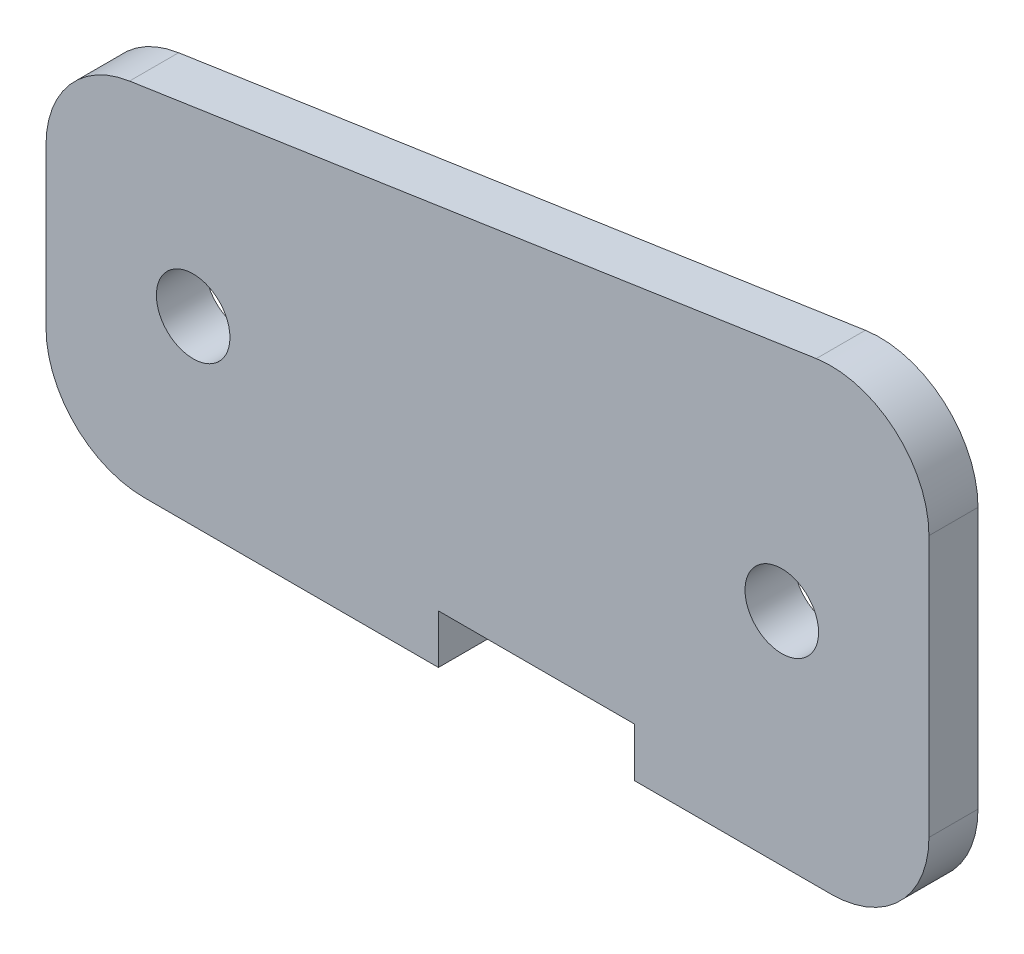
ISO-10303-21;
HEADER;
FILE_DESCRIPTION(('STEP AP214'),'2;1');
FILE_NAME('part.step','',(''),(''),'','','');
FILE_SCHEMA(('AUTOMOTIVE_DESIGN { 1 0 10303 214 1 1 1 1 }'));
ENDSEC;
DATA;
#1=APPLICATION_CONTEXT('core data for automotive mechanical design processes');
#2=APPLICATION_PROTOCOL_DEFINITION('international standard','automotive_design',2000,#1);
#3=PRODUCT_CONTEXT('',#1,'mechanical');
#4=PRODUCT('Part','Part','',(#3));
#5=PRODUCT_RELATED_PRODUCT_CATEGORY('part','',(#4));
#6=PRODUCT_DEFINITION_FORMATION('','',#4);
#7=PRODUCT_DEFINITION_CONTEXT('part definition',#1,'design');
#8=PRODUCT_DEFINITION('design','',#6,#7);
#9=PRODUCT_DEFINITION_SHAPE('','',#8);
#10=(LENGTH_UNIT() NAMED_UNIT(*) SI_UNIT(.MILLI.,.METRE.));
#11=(NAMED_UNIT(*) PLANE_ANGLE_UNIT() SI_UNIT($,.RADIAN.));
#12=(NAMED_UNIT(*) SI_UNIT($,.STERADIAN.) SOLID_ANGLE_UNIT());
#13=UNCERTAINTY_MEASURE_WITH_UNIT(LENGTH_MEASURE(1.E-05),#10,'distance_accuracy_value','');
#14=(GEOMETRIC_REPRESENTATION_CONTEXT(3) GLOBAL_UNCERTAINTY_ASSIGNED_CONTEXT((#13)) GLOBAL_UNIT_ASSIGNED_CONTEXT((#10,
#11,#12)) REPRESENTATION_CONTEXT('',''));
#15=CARTESIAN_POINT('',(0.,0.,0.));
#16=DIRECTION('',(0.,0.,1.));
#17=DIRECTION('',(1.,0.,0.));
#18=AXIS2_PLACEMENT_3D('',#15,#16,#17);
#19=CARTESIAN_POINT('',(-225.200505145563,23.9331419592028,3.175));
#20=DIRECTION('',(0.,0.,-1.));
#21=DIRECTION('',(-1.,0.,0.));
#22=AXIS2_PLACEMENT_3D('',#19,#20,#21);
#23=CYLINDRICAL_SURFACE('',#22,6.35);
#24=CARTESIAN_POINT('',(-225.200505145563,23.9331419592028,0.));
#25=DIRECTION('',(0.,0.,1.));
#26=DIRECTION('',(1.,0.,0.));
#27=AXIS2_PLACEMENT_3D('',#24,#25,#26);
#28=CIRCLE('',#27,6.35);
#29=CARTESIAN_POINT('',(-218.850505145563,23.9331419592027,0.));
#30=VERTEX_POINT('',#29);
#31=CARTESIAN_POINT('',(-226.14246702167,30.2128877999165,0.));
#32=VERTEX_POINT('',#31);
#33=EDGE_CURVE('E160',#30,#32,#28,.T.);
#34=ORIENTED_EDGE('',*,*,#33,.T.);
#35=DIRECTION('',(0.,0.,-1.));
#36=VECTOR('',#35,1.);
#37=CARTESIAN_POINT('',(-226.14246702167,30.2128877999165,3.175));
#38=LINE('',#37,#36);
#39=CARTESIAN_POINT('',(-226.14246702167,30.2128877999165,3.175));
#40=VERTEX_POINT('',#39);
#41=EDGE_CURVE('E11',#40,#32,#38,.T.);
#42=ORIENTED_EDGE('',*,*,#41,.F.);
#43=CARTESIAN_POINT('',(-225.200505145563,23.9331419592028,3.175));
#44=DIRECTION('',(0.,0.,1.));
#45=DIRECTION('',(1.,0.,0.));
#46=AXIS2_PLACEMENT_3D('',#43,#44,#45);
#47=CIRCLE('',#46,6.35);
#48=CARTESIAN_POINT('',(-218.850505145563,23.9331419592027,3.175));
#49=VERTEX_POINT('',#48);
#50=EDGE_CURVE('E100',#49,#40,#47,.T.);
#51=ORIENTED_EDGE('',*,*,#50,.F.);
#52=DIRECTION('',(0.,0.,-1.));
#53=VECTOR('',#52,1.);
#54=CARTESIAN_POINT('',(-218.850505145563,23.9331419592027,3.175));
#55=LINE('',#54,#53);
#56=EDGE_CURVE('E51',#49,#30,#55,.T.);
#57=ORIENTED_EDGE('',*,*,#56,.T.);
#58=EDGE_LOOP('',(#34,#42,#51,#57));
#59=FACE_BOUND('',#58,.T.);
#60=ADVANCED_FACE('F35',(#59),#23,.T.);
#61=CARTESIAN_POINT('',(-9.40844858481667,62.7229905654444,3.175));
#62=DIRECTION('',(-0.148340452930245,0.988936352868297,0.));
#63=DIRECTION('',(-0.988936352868298,-0.148340452930245,0.));
#64=AXIS2_PLACEMENT_3D('',#61,#62,#63);
#65=PLANE('',#64);
#66=DIRECTION('',(0.988936352868298,0.148340452930245,0.));
#67=VECTOR('',#66,1.);
#68=CARTESIAN_POINT('',(-9.40844858481667,62.7229905654444,0.));
#69=LINE('',#68,#67);
#70=CARTESIAN_POINT('',(-270.59246702167,23.5453877999165,0.));
#71=VERTEX_POINT('',#70);
#72=EDGE_CURVE('E162',#71,#32,#69,.T.);
#73=ORIENTED_EDGE('',*,*,#72,.F.);
#74=DIRECTION('',(0.,0.,-1.));
#75=VECTOR('',#74,1.);
#76=CARTESIAN_POINT('',(-270.59246702167,23.5453877999165,3.175));
#77=LINE('',#76,#75);
#78=CARTESIAN_POINT('',(-270.59246702167,23.5453877999165,3.175));
#79=VERTEX_POINT('',#78);
#80=EDGE_CURVE('E43',#79,#71,#77,.T.);
#81=ORIENTED_EDGE('',*,*,#80,.F.);
#82=DIRECTION('',(0.988936352868298,0.148340452930245,0.));
#83=VECTOR('',#82,1.);
#84=CARTESIAN_POINT('',(-9.40844858481667,62.7229905654444,3.175));
#85=LINE('',#84,#83);
#86=EDGE_CURVE('E271',#79,#40,#85,.T.);
#87=ORIENTED_EDGE('',*,*,#86,.T.);
#88=ORIENTED_EDGE('',*,*,#41,.T.);
#89=EDGE_LOOP('',(#73,#81,#87,#88));
#90=FACE_BOUND('',#89,.T.);
#91=ADVANCED_FACE('F221',(#90),#65,.T.);
#92=CARTESIAN_POINT('',(-269.650505145563,17.2656419592028,3.175));
#93=DIRECTION('',(0.,0.,-1.));
#94=DIRECTION('',(-1.,0.,0.));
#95=AXIS2_PLACEMENT_3D('',#92,#93,#94);
#96=CYLINDRICAL_SURFACE('',#95,6.35000000000001);
#97=CARTESIAN_POINT('',(-269.650505145563,17.2656419592028,0.));
#98=DIRECTION('',(0.,0.,1.));
#99=DIRECTION('',(1.,0.,0.));
#100=AXIS2_PLACEMENT_3D('',#97,#98,#99);
#101=CIRCLE('',#100,6.35000000000001);
#102=CARTESIAN_POINT('',(-276.000505145563,17.2656419592027,0.));
#103=VERTEX_POINT('',#102);
#104=EDGE_CURVE('E165',#103,#71,#101,.F.);
#105=ORIENTED_EDGE('',*,*,#104,.F.);
#106=DIRECTION('',(0.,0.,-1.));
#107=VECTOR('',#106,1.);
#108=CARTESIAN_POINT('',(-276.000505145563,17.2656419592027,3.175));
#109=LINE('',#108,#107);
#110=CARTESIAN_POINT('',(-276.000505145563,17.2656419592027,3.175));
#111=VERTEX_POINT('',#110);
#112=EDGE_CURVE('E211',#111,#103,#109,.T.);
#113=ORIENTED_EDGE('',*,*,#112,.F.);
#114=CARTESIAN_POINT('',(-269.650505145563,17.2656419592028,3.175));
#115=DIRECTION('',(0.,0.,1.));
#116=DIRECTION('',(1.,0.,0.));
#117=AXIS2_PLACEMENT_3D('',#114,#115,#116);
#118=CIRCLE('',#117,6.35000000000001);
#119=EDGE_CURVE('E218',#111,#79,#118,.F.);
#120=ORIENTED_EDGE('',*,*,#119,.T.);
#121=ORIENTED_EDGE('',*,*,#80,.T.);
#122=EDGE_LOOP('',(#105,#113,#120,#121));
#123=FACE_BOUND('',#122,.T.);
#124=ADVANCED_FACE('F216',(#123),#96,.T.);
#125=CARTESIAN_POINT('',(-276.000505145563,0.,3.175));
#126=DIRECTION('',(1.,0.,0.));
#127=DIRECTION('',(0.,0.,-1.));
#128=AXIS2_PLACEMENT_3D('',#125,#126,#127);
#129=PLANE('',#128);
#130=DIRECTION('',(0.,-1.,0.));
#131=VECTOR('',#130,1.);
#132=CARTESIAN_POINT('',(-276.000505145563,0.,0.));
#133=LINE('',#132,#131);
#134=CARTESIAN_POINT('',(-276.000505145563,7.01793208133255,0.));
#135=VERTEX_POINT('',#134);
#136=EDGE_CURVE('E168',#103,#135,#133,.T.);
#137=ORIENTED_EDGE('',*,*,#136,.T.);
#138=DIRECTION('',(0.,0.,-1.));
#139=VECTOR('',#138,1.);
#140=CARTESIAN_POINT('',(-276.000505145563,7.01793208133255,3.175));
#141=LINE('',#140,#139);
#142=CARTESIAN_POINT('',(-276.000505145563,7.01793208133255,3.175));
#143=VERTEX_POINT('',#142);
#144=EDGE_CURVE('E208',#143,#135,#141,.T.);
#145=ORIENTED_EDGE('',*,*,#144,.F.);
#146=DIRECTION('',(0.,-1.,0.));
#147=VECTOR('',#146,1.);
#148=CARTESIAN_POINT('',(-276.000505145563,0.,3.175));
#149=LINE('',#148,#147);
#150=EDGE_CURVE('E239',#111,#143,#149,.T.);
#151=ORIENTED_EDGE('',*,*,#150,.F.);
#152=ORIENTED_EDGE('',*,*,#112,.T.);
#153=EDGE_LOOP('',(#137,#145,#151,#152));
#154=FACE_BOUND('',#153,.T.);
#155=ADVANCED_FACE('F229',(#154),#129,.F.);
#156=CARTESIAN_POINT('',(-269.650505145563,7.0179320813325,3.175));
#157=DIRECTION('',(0.,0.,-1.));
#158=DIRECTION('',(-1.,0.,0.));
#159=AXIS2_PLACEMENT_3D('',#156,#157,#158);
#160=CYLINDRICAL_SURFACE('',#159,6.35000000000001);
#161=CARTESIAN_POINT('',(-269.650505145563,7.0179320813325,0.));
#162=DIRECTION('',(0.,0.,1.));
#163=DIRECTION('',(1.,0.,0.));
#164=AXIS2_PLACEMENT_3D('',#161,#162,#163);
#165=CIRCLE('',#164,6.35000000000001);
#166=CARTESIAN_POINT('',(-269.650505145563,0.667932081332504,0.));
#167=VERTEX_POINT('',#166);
#168=EDGE_CURVE('E170',#135,#167,#165,.T.);
#169=ORIENTED_EDGE('',*,*,#168,.T.);
#170=DIRECTION('',(0.,0.,-1.));
#171=VECTOR('',#170,1.);
#172=CARTESIAN_POINT('',(-269.650505145563,0.667932081332504,3.175));
#173=LINE('',#172,#171);
#174=CARTESIAN_POINT('',(-269.650505145563,0.667932081332504,3.175));
#175=VERTEX_POINT('',#174);
#176=EDGE_CURVE('E206',#175,#167,#173,.T.);
#177=ORIENTED_EDGE('',*,*,#176,.F.);
#178=CARTESIAN_POINT('',(-269.650505145563,7.0179320813325,3.175));
#179=DIRECTION('',(0.,0.,1.));
#180=DIRECTION('',(1.,0.,0.));
#181=AXIS2_PLACEMENT_3D('',#178,#179,#180);
#182=CIRCLE('',#181,6.35000000000001);
#183=EDGE_CURVE('E235',#143,#175,#182,.T.);
#184=ORIENTED_EDGE('',*,*,#183,.F.);
#185=ORIENTED_EDGE('',*,*,#144,.T.);
#186=EDGE_LOOP('',(#169,#177,#184,#185));
#187=FACE_BOUND('',#186,.T.);
#188=ADVANCED_FACE('F233',(#187),#160,.T.);
#189=CARTESIAN_POINT('',(0.,0.667932081332504,3.175));
#190=DIRECTION('',(0.,-1.,0.));
#191=DIRECTION('',(0.,0.,-1.));
#192=AXIS2_PLACEMENT_3D('',#189,#190,#191);
#193=PLANE('',#192);
#194=DIRECTION('',(-1.,0.,0.));
#195=VECTOR('',#194,1.);
#196=CARTESIAN_POINT('',(0.,0.667932081332504,0.));
#197=LINE('',#196,#195);
#198=CARTESIAN_POINT('',(-250.600505145563,0.667932081332504,0.));
#199=VERTEX_POINT('',#198);
#200=EDGE_CURVE('E173',#199,#167,#197,.T.);
#201=ORIENTED_EDGE('',*,*,#200,.F.);
#202=DIRECTION('',(0.,0.,-1.));
#203=VECTOR('',#202,1.);
#204=CARTESIAN_POINT('',(-250.600505145563,0.667932081332504,3.175));
#205=LINE('',#204,#203);
#206=CARTESIAN_POINT('',(-250.600505145563,0.667932081332504,3.175));
#207=VERTEX_POINT('',#206);
#208=EDGE_CURVE('E204',#207,#199,#205,.T.);
#209=ORIENTED_EDGE('',*,*,#208,.F.);
#210=DIRECTION('',(-1.,0.,0.));
#211=VECTOR('',#210,1.);
#212=CARTESIAN_POINT('',(0.,0.667932081332504,3.175));
#213=LINE('',#212,#211);
#214=EDGE_CURVE('E238',#207,#175,#213,.T.);
#215=ORIENTED_EDGE('',*,*,#214,.T.);
#216=ORIENTED_EDGE('',*,*,#176,.T.);
#217=EDGE_LOOP('',(#201,#209,#215,#216));
#218=FACE_BOUND('',#217,.T.);
#219=ADVANCED_FACE('F283',(#218),#193,.T.);
#220=CARTESIAN_POINT('',(-250.600505145563,0.,3.175));
#221=DIRECTION('',(-1.,0.,0.));
#222=DIRECTION('',(0.,0.,1.));
#223=AXIS2_PLACEMENT_3D('',#220,#221,#222);
#224=PLANE('',#223);
#225=DIRECTION('',(0.,1.,0.));
#226=VECTOR('',#225,1.);
#227=CARTESIAN_POINT('',(-250.600505145563,0.,0.));
#228=LINE('',#227,#226);
#229=CARTESIAN_POINT('',(-250.600505145563,3.8429320813325,0.));
#230=VERTEX_POINT('',#229);
#231=EDGE_CURVE('E176',#199,#230,#228,.T.);
#232=ORIENTED_EDGE('',*,*,#231,.T.);
#233=DIRECTION('',(0.,0.,-1.));
#234=VECTOR('',#233,1.);
#235=CARTESIAN_POINT('',(-250.600505145563,3.8429320813325,3.175));
#236=LINE('',#235,#234);
#237=CARTESIAN_POINT('',(-250.600505145563,3.8429320813325,3.175));
#238=VERTEX_POINT('',#237);
#239=EDGE_CURVE('E201',#238,#230,#236,.T.);
#240=ORIENTED_EDGE('',*,*,#239,.F.);
#241=DIRECTION('',(0.,1.,0.));
#242=VECTOR('',#241,1.);
#243=CARTESIAN_POINT('',(-250.600505145563,0.,3.175));
#244=LINE('',#243,#242);
#245=EDGE_CURVE('E241',#207,#238,#244,.T.);
#246=ORIENTED_EDGE('',*,*,#245,.F.);
#247=ORIENTED_EDGE('',*,*,#208,.T.);
#248=EDGE_LOOP('',(#232,#240,#246,#247));
#249=FACE_BOUND('',#248,.T.);
#250=ADVANCED_FACE('F286',(#249),#224,.F.);
#251=CARTESIAN_POINT('',(0.,3.8429320813325,3.175));
#252=DIRECTION('',(0.,1.,0.));
#253=DIRECTION('',(0.,0.,1.));
#254=AXIS2_PLACEMENT_3D('',#251,#252,#253);
#255=PLANE('',#254);
#256=DIRECTION('',(1.,0.,0.));
#257=VECTOR('',#256,1.);
#258=CARTESIAN_POINT('',(0.,3.8429320813325,0.));
#259=LINE('',#258,#257);
#260=CARTESIAN_POINT('',(-237.900505145563,3.8429320813325,0.));
#261=VERTEX_POINT('',#260);
#262=EDGE_CURVE('E178',#230,#261,#259,.T.);
#263=ORIENTED_EDGE('',*,*,#262,.T.);
#264=DIRECTION('',(0.,0.,-1.));
#265=VECTOR('',#264,1.);
#266=CARTESIAN_POINT('',(-237.900505145563,3.8429320813325,3.175));
#267=LINE('',#266,#265);
#268=CARTESIAN_POINT('',(-237.900505145563,3.8429320813325,3.175));
#269=VERTEX_POINT('',#268);
#270=EDGE_CURVE('E199',#269,#261,#267,.T.);
#271=ORIENTED_EDGE('',*,*,#270,.F.);
#272=DIRECTION('',(1.,0.,0.));
#273=VECTOR('',#272,1.);
#274=CARTESIAN_POINT('',(0.,3.8429320813325,3.175));
#275=LINE('',#274,#273);
#276=EDGE_CURVE('E247',#238,#269,#275,.T.);
#277=ORIENTED_EDGE('',*,*,#276,.F.);
#278=ORIENTED_EDGE('',*,*,#239,.T.);
#279=EDGE_LOOP('',(#263,#271,#277,#278));
#280=FACE_BOUND('',#279,.T.);
#281=ADVANCED_FACE('F290',(#280),#255,.F.);
#282=CARTESIAN_POINT('',(-237.900505145563,2.07970565655558E-12,3.175));
#283=DIRECTION('',(-1.,0.,0.));
#284=DIRECTION('',(0.,-1.,0.));
#285=AXIS2_PLACEMENT_3D('',#282,#283,#284);
#286=PLANE('',#285);
#287=DIRECTION('',(0.,1.,0.));
#288=VECTOR('',#287,1.);
#289=CARTESIAN_POINT('',(-237.900505145563,2.07970565655558E-12,0.));
#290=LINE('',#289,#288);
#291=CARTESIAN_POINT('',(-237.900505145563,0.667932081332504,0.));
#292=VERTEX_POINT('',#291);
#293=EDGE_CURVE('E181',#292,#261,#290,.T.);
#294=ORIENTED_EDGE('',*,*,#293,.F.);
#295=DIRECTION('',(0.,0.,-1.));
#296=VECTOR('',#295,1.);
#297=CARTESIAN_POINT('',(-237.900505145563,0.667932081332504,3.175));
#298=LINE('',#297,#296);
#299=CARTESIAN_POINT('',(-237.900505145563,0.667932081332504,3.175));
#300=VERTEX_POINT('',#299);
#301=EDGE_CURVE('E138',#300,#292,#298,.T.);
#302=ORIENTED_EDGE('',*,*,#301,.F.);
#303=DIRECTION('',(0.,1.,0.));
#304=VECTOR('',#303,1.);
#305=CARTESIAN_POINT('',(-237.900505145563,2.07970565655558E-12,3.175));
#306=LINE('',#305,#304);
#307=EDGE_CURVE('E146',#300,#269,#306,.T.);
#308=ORIENTED_EDGE('',*,*,#307,.T.);
#309=ORIENTED_EDGE('',*,*,#270,.T.);
#310=EDGE_LOOP('',(#294,#302,#308,#309));
#311=FACE_BOUND('',#310,.T.);
#312=ADVANCED_FACE('F250',(#311),#286,.T.);
#313=CARTESIAN_POINT('',(0.,0.667932081332504,3.175));
#314=DIRECTION('',(0.,-1.,0.));
#315=DIRECTION('',(0.,0.,-1.));
#316=AXIS2_PLACEMENT_3D('',#313,#314,#315);
#317=PLANE('',#316);
#318=DIRECTION('',(-1.,0.,0.));
#319=VECTOR('',#318,1.);
#320=CARTESIAN_POINT('',(0.,0.667932081332504,0.));
#321=LINE('',#320,#319);
#322=CARTESIAN_POINT('',(-225.200505145563,0.667932081332504,0.));
#323=VERTEX_POINT('',#322);
#324=EDGE_CURVE('E134',#323,#292,#321,.T.);
#325=ORIENTED_EDGE('',*,*,#324,.F.);
#326=DIRECTION('',(0.,0.,-1.));
#327=VECTOR('',#326,1.);
#328=CARTESIAN_POINT('',(-225.200505145563,0.667932081332504,3.175));
#329=LINE('',#328,#327);
#330=CARTESIAN_POINT('',(-225.200505145563,0.667932081332504,3.175));
#331=VERTEX_POINT('',#330);
#332=EDGE_CURVE('E129',#331,#323,#329,.T.);
#333=ORIENTED_EDGE('',*,*,#332,.F.);
#334=DIRECTION('',(-1.,0.,0.));
#335=VECTOR('',#334,1.);
#336=CARTESIAN_POINT('',(0.,0.667932081332504,3.175));
#337=LINE('',#336,#335);
#338=EDGE_CURVE('E132',#331,#300,#337,.T.);
#339=ORIENTED_EDGE('',*,*,#338,.T.);
#340=ORIENTED_EDGE('',*,*,#301,.T.);
#341=EDGE_LOOP('',(#325,#333,#339,#340));
#342=FACE_BOUND('',#341,.T.);
#343=ADVANCED_FACE('F131',(#342),#317,.T.);
#344=CARTESIAN_POINT('',(-225.200505145563,7.0179320813325,3.175));
#345=DIRECTION('',(0.,0.,-1.));
#346=DIRECTION('',(-1.,0.,0.));
#347=AXIS2_PLACEMENT_3D('',#344,#345,#346);
#348=CYLINDRICAL_SURFACE('',#347,6.35);
#349=CARTESIAN_POINT('',(-225.200505145563,7.0179320813325,0.));
#350=DIRECTION('',(0.,0.,1.));
#351=DIRECTION('',(1.,0.,0.));
#352=AXIS2_PLACEMENT_3D('',#349,#350,#351);
#353=CIRCLE('',#352,6.35);
#354=CARTESIAN_POINT('',(-218.850505145563,7.01793208133255,0.));
#355=VERTEX_POINT('',#354);
#356=EDGE_CURVE('E185',#355,#323,#353,.F.);
#357=ORIENTED_EDGE('',*,*,#356,.F.);
#358=DIRECTION('',(0.,0.,-1.));
#359=VECTOR('',#358,1.);
#360=CARTESIAN_POINT('',(-218.850505145563,7.01793208133255,3.175));
#361=LINE('',#360,#359);
#362=CARTESIAN_POINT('',(-218.850505145563,7.01793208133255,3.175));
#363=VERTEX_POINT('',#362);
#364=EDGE_CURVE('E88',#363,#355,#361,.T.);
#365=ORIENTED_EDGE('',*,*,#364,.F.);
#366=CARTESIAN_POINT('',(-225.200505145563,7.0179320813325,3.175));
#367=DIRECTION('',(0.,0.,1.));
#368=DIRECTION('',(1.,0.,0.));
#369=AXIS2_PLACEMENT_3D('',#366,#367,#368);
#370=CIRCLE('',#369,6.35);
#371=EDGE_CURVE('E144',#363,#331,#370,.F.);
#372=ORIENTED_EDGE('',*,*,#371,.T.);
#373=ORIENTED_EDGE('',*,*,#332,.T.);
#374=EDGE_LOOP('',(#357,#365,#372,#373));
#375=FACE_BOUND('',#374,.T.);
#376=ADVANCED_FACE('F148',(#375),#348,.T.);
#377=CARTESIAN_POINT('',(-266.475505145563,12.4154320813317,3.175));
#378=DIRECTION('',(0.,0.,-1.));
#379=DIRECTION('',(-1.,0.,0.));
#380=AXIS2_PLACEMENT_3D('',#377,#378,#379);
#381=CYLINDRICAL_SURFACE('',#380,2.38125000000001);
#382=CARTESIAN_POINT('',(-266.475505145563,12.4154320813317,3.175));
#383=DIRECTION('',(0.,0.,1.));
#384=DIRECTION('',(1.,0.,0.));
#385=AXIS2_PLACEMENT_3D('',#382,#383,#384);
#386=CIRCLE('',#385,2.38125000000001);
#387=CARTESIAN_POINT('',(-264.094255145563,12.4154320813317,3.175));
#388=VERTEX_POINT('',#387);
#389=EDGE_CURVE('E151',#388,#388,#386,.T.);
#390=ORIENTED_EDGE('',*,*,#389,.T.);
#391=EDGE_LOOP('',(#390));
#392=FACE_BOUND('',#391,.T.);
#393=CARTESIAN_POINT('',(-266.475505145563,12.4154320813317,0.));
#394=DIRECTION('',(0.,0.,1.));
#395=DIRECTION('',(1.,0.,0.));
#396=AXIS2_PLACEMENT_3D('',#393,#394,#395);
#397=CIRCLE('',#396,2.38125000000001);
#398=CARTESIAN_POINT('',(-264.094255145563,12.4154320813317,0.));
#399=VERTEX_POINT('',#398);
#400=EDGE_CURVE('E190',#399,#399,#397,.T.);
#401=ORIENTED_EDGE('',*,*,#400,.F.);
#402=EDGE_LOOP('',(#401));
#403=FACE_BOUND('',#402,.T.);
#404=ADVANCED_FACE('F256',(#392,#403),#381,.F.);
#405=CARTESIAN_POINT('',(-218.850505145563,-3.59104131012478E-13,3.175));
#406=DIRECTION('',(1.,0.,0.));
#407=DIRECTION('',(0.,1.,0.));
#408=AXIS2_PLACEMENT_3D('',#405,#406,#407);
#409=PLANE('',#408);
#410=DIRECTION('',(0.,-1.,0.));
#411=VECTOR('',#410,1.);
#412=CARTESIAN_POINT('',(-218.850505145563,-3.59104131012478E-13,0.));
#413=LINE('',#412,#411);
#414=EDGE_CURVE('E187',#30,#355,#413,.T.);
#415=ORIENTED_EDGE('',*,*,#414,.F.);
#416=ORIENTED_EDGE('',*,*,#56,.F.);
#417=DIRECTION('',(0.,-1.,0.));
#418=VECTOR('',#417,1.);
#419=CARTESIAN_POINT('',(-218.850505145563,-3.59104131012478E-13,3.175));
#420=LINE('',#419,#418);
#421=EDGE_CURVE('E149',#49,#363,#420,.T.);
#422=ORIENTED_EDGE('',*,*,#421,.T.);
#423=ORIENTED_EDGE('',*,*,#364,.T.);
#424=EDGE_LOOP('',(#415,#416,#422,#423));
#425=FACE_BOUND('',#424,.T.);
#426=ADVANCED_FACE('F253',(#425),#409,.T.);
#427=CARTESIAN_POINT('',(-228.375505145563,14.9389660406656,3.175));
#428=DIRECTION('',(0.,0.,-1.));
#429=DIRECTION('',(-1.,0.,0.));
#430=AXIS2_PLACEMENT_3D('',#427,#428,#429);
#431=CYLINDRICAL_SURFACE('',#430,2.38125);
#432=CARTESIAN_POINT('',(-228.375505145563,14.9389660406656,3.175));
#433=DIRECTION('',(0.,0.,1.));
#434=DIRECTION('',(1.,0.,0.));
#435=AXIS2_PLACEMENT_3D('',#432,#433,#434);
#436=CIRCLE('',#435,2.38125);
#437=CARTESIAN_POINT('',(-225.994255145563,14.9389660406656,3.175));
#438=VERTEX_POINT('',#437);
#439=EDGE_CURVE('E157',#438,#438,#436,.T.);
#440=ORIENTED_EDGE('',*,*,#439,.T.);
#441=EDGE_LOOP('',(#440));
#442=FACE_BOUND('',#441,.T.);
#443=CARTESIAN_POINT('',(-228.375505145563,14.9389660406656,0.));
#444=DIRECTION('',(0.,0.,1.));
#445=DIRECTION('',(1.,0.,0.));
#446=AXIS2_PLACEMENT_3D('',#443,#444,#445);
#447=CIRCLE('',#446,2.38125);
#448=CARTESIAN_POINT('',(-225.994255145563,14.9389660406656,0.));
#449=VERTEX_POINT('',#448);
#450=EDGE_CURVE('E193',#449,#449,#447,.T.);
#451=ORIENTED_EDGE('',*,*,#450,.F.);
#452=EDGE_LOOP('',(#451));
#453=FACE_BOUND('',#452,.T.);
#454=ADVANCED_FACE('F255',(#442,#453),#431,.F.);
#455=CARTESIAN_POINT('',(0.,0.,3.175));
#456=DIRECTION('',(0.,0.,1.));
#457=DIRECTION('',(1.,0.,0.));
#458=AXIS2_PLACEMENT_3D('',#455,#456,#457);
#459=PLANE('',#458);
#460=ORIENTED_EDGE('',*,*,#50,.T.);
#461=ORIENTED_EDGE('',*,*,#86,.F.);
#462=ORIENTED_EDGE('',*,*,#119,.F.);
#463=ORIENTED_EDGE('',*,*,#150,.T.);
#464=ORIENTED_EDGE('',*,*,#183,.T.);
#465=ORIENTED_EDGE('',*,*,#214,.F.);
#466=ORIENTED_EDGE('',*,*,#245,.T.);
#467=ORIENTED_EDGE('',*,*,#276,.T.);
#468=ORIENTED_EDGE('',*,*,#307,.F.);
#469=ORIENTED_EDGE('',*,*,#338,.F.);
#470=ORIENTED_EDGE('',*,*,#371,.F.);
#471=ORIENTED_EDGE('',*,*,#421,.F.);
#472=EDGE_LOOP('',(#460,#461,#462,#463,#464,#465,#466,#467,#468,#469,#470,#471));
#473=FACE_BOUND('',#472,.T.);
#474=ORIENTED_EDGE('',*,*,#389,.F.);
#475=EDGE_LOOP('',(#474));
#476=FACE_BOUND('',#475,.T.);
#477=ORIENTED_EDGE('',*,*,#439,.F.);
#478=EDGE_LOOP('',(#477));
#479=FACE_BOUND('',#478,.T.);
#480=ADVANCED_FACE('F142',(#473,#476,#479),#459,.T.);
#481=CARTESIAN_POINT('',(0.,0.,0.));
#482=DIRECTION('',(0.,0.,1.));
#483=DIRECTION('',(1.,0.,0.));
#484=AXIS2_PLACEMENT_3D('',#481,#482,#483);
#485=PLANE('',#484);
#486=ORIENTED_EDGE('',*,*,#33,.F.);
#487=ORIENTED_EDGE('',*,*,#414,.T.);
#488=ORIENTED_EDGE('',*,*,#356,.T.);
#489=ORIENTED_EDGE('',*,*,#324,.T.);
#490=ORIENTED_EDGE('',*,*,#293,.T.);
#491=ORIENTED_EDGE('',*,*,#262,.F.);
#492=ORIENTED_EDGE('',*,*,#231,.F.);
#493=ORIENTED_EDGE('',*,*,#200,.T.);
#494=ORIENTED_EDGE('',*,*,#168,.F.);
#495=ORIENTED_EDGE('',*,*,#136,.F.);
#496=ORIENTED_EDGE('',*,*,#104,.T.);
#497=ORIENTED_EDGE('',*,*,#72,.T.);
#498=EDGE_LOOP('',(#486,#487,#488,#489,#490,#491,#492,#493,#494,#495,#496,#497));
#499=FACE_BOUND('',#498,.T.);
#500=ORIENTED_EDGE('',*,*,#400,.T.);
#501=EDGE_LOOP('',(#500));
#502=FACE_BOUND('',#501,.T.);
#503=ORIENTED_EDGE('',*,*,#450,.T.);
#504=EDGE_LOOP('',(#503));
#505=FACE_BOUND('',#504,.T.);
#506=ADVANCED_FACE('F224',(#499,#502,#505),#485,.F.);
#507=CLOSED_SHELL('',(#60,#91,#124,#155,#188,#219,#250,#281,#312,#343,#376,#404,#426,#454,#480,#506));
#508=MANIFOLD_SOLID_BREP('B2',#507);
#509=ADVANCED_BREP_SHAPE_REPRESENTATION('',(#18,#508),#14);
#510=SHAPE_DEFINITION_REPRESENTATION(#9,#509);
ENDSEC;
END-ISO-10303-21;
